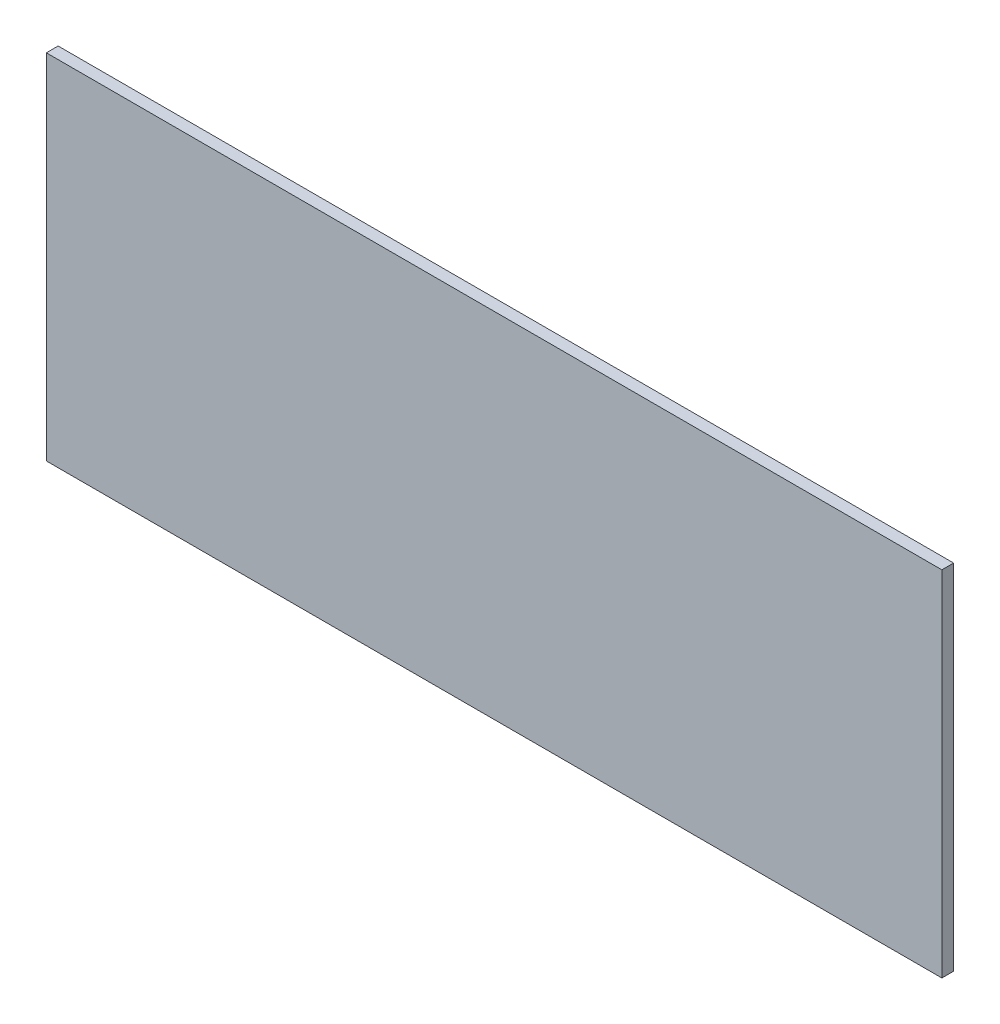
ISO-10303-21;
HEADER;
FILE_DESCRIPTION(('STEP AP214'),'2;1');
FILE_NAME('part.step','',(''),(''),'','','');
FILE_SCHEMA(('AUTOMOTIVE_DESIGN { 1 0 10303 214 1 1 1 1 }'));
ENDSEC;
DATA;
#1=APPLICATION_CONTEXT('core data for automotive mechanical design processes');
#2=APPLICATION_PROTOCOL_DEFINITION('international standard','automotive_design',2000,#1);
#3=PRODUCT_CONTEXT('',#1,'mechanical');
#4=PRODUCT('Part','Part','',(#3));
#5=PRODUCT_RELATED_PRODUCT_CATEGORY('part','',(#4));
#6=PRODUCT_DEFINITION_FORMATION('','',#4);
#7=PRODUCT_DEFINITION_CONTEXT('part definition',#1,'design');
#8=PRODUCT_DEFINITION('design','',#6,#7);
#9=PRODUCT_DEFINITION_SHAPE('','',#8);
#10=(LENGTH_UNIT() NAMED_UNIT(*) SI_UNIT(.MILLI.,.METRE.));
#11=(NAMED_UNIT(*) PLANE_ANGLE_UNIT() SI_UNIT($,.RADIAN.));
#12=(NAMED_UNIT(*) SI_UNIT($,.STERADIAN.) SOLID_ANGLE_UNIT());
#13=UNCERTAINTY_MEASURE_WITH_UNIT(LENGTH_MEASURE(1.E-05),#10,'distance_accuracy_value','');
#14=(GEOMETRIC_REPRESENTATION_CONTEXT(3) GLOBAL_UNCERTAINTY_ASSIGNED_CONTEXT((#13)) GLOBAL_UNIT_ASSIGNED_CONTEXT((#10,
#11,#12)) REPRESENTATION_CONTEXT('',''));
#15=CARTESIAN_POINT('',(0.,0.,0.));
#16=DIRECTION('',(0.,0.,1.));
#17=DIRECTION('',(1.,0.,0.));
#18=AXIS2_PLACEMENT_3D('',#15,#16,#17);
#19=CARTESIAN_POINT('',(-191.531306325637,22.8926701570681,5.));
#20=DIRECTION('',(1.,0.,0.));
#21=DIRECTION('',(0.,1.,0.));
#22=AXIS2_PLACEMENT_3D('',#19,#20,#21);
#23=PLANE('',#22);
#24=DIRECTION('',(0.,-1.,0.));
#25=VECTOR('',#24,1.);
#26=CARTESIAN_POINT('',(-191.531306325637,22.8926701570681,0.));
#27=LINE('',#26,#25);
#28=CARTESIAN_POINT('',(-191.531306325637,22.8926701570681,0.));
#29=VERTEX_POINT('',#28);
#30=CARTESIAN_POINT('',(-191.531306325637,-127.107329842932,0.));
#31=VERTEX_POINT('',#30);
#32=EDGE_CURVE('E96',#29,#31,#27,.T.);
#33=ORIENTED_EDGE('',*,*,#32,.T.);
#34=DIRECTION('',(0.,0.,-1.));
#35=VECTOR('',#34,1.);
#36=CARTESIAN_POINT('',(-191.531306325637,-127.107329842932,5.));
#37=LINE('',#36,#35);
#38=CARTESIAN_POINT('',(-191.531306325637,-127.107329842932,5.));
#39=VERTEX_POINT('',#38);
#40=EDGE_CURVE('E11',#39,#31,#37,.T.);
#41=ORIENTED_EDGE('',*,*,#40,.F.);
#42=DIRECTION('',(0.,-1.,0.));
#43=VECTOR('',#42,1.);
#44=CARTESIAN_POINT('',(-191.531306325637,22.8926701570681,5.));
#45=LINE('',#44,#43);
#46=CARTESIAN_POINT('',(-191.531306325637,22.8926701570681,5.));
#47=VERTEX_POINT('',#46);
#48=EDGE_CURVE('E84',#47,#39,#45,.T.);
#49=ORIENTED_EDGE('',*,*,#48,.F.);
#50=DIRECTION('',(0.,0.,-1.));
#51=VECTOR('',#50,1.);
#52=CARTESIAN_POINT('',(-191.531306325637,22.8926701570681,5.));
#53=LINE('',#52,#51);
#54=EDGE_CURVE('E92',#47,#29,#53,.T.);
#55=ORIENTED_EDGE('',*,*,#54,.T.);
#56=EDGE_LOOP('',(#33,#41,#49,#55));
#57=FACE_BOUND('',#56,.T.);
#58=ADVANCED_FACE('F33',(#57),#23,.F.);
#59=CARTESIAN_POINT('',(-191.531306325637,-127.107329842932,5.));
#60=DIRECTION('',(0.,1.,0.));
#61=DIRECTION('',(0.,0.,1.));
#62=AXIS2_PLACEMENT_3D('',#59,#60,#61);
#63=PLANE('',#62);
#64=DIRECTION('',(1.,0.,0.));
#65=VECTOR('',#64,1.);
#66=CARTESIAN_POINT('',(-191.531306325637,-127.107329842932,0.));
#67=LINE('',#66,#65);
#68=CARTESIAN_POINT('',(188.468693674363,-127.107329842932,0.));
#69=VERTEX_POINT('',#68);
#70=EDGE_CURVE('E88',#31,#69,#67,.T.);
#71=ORIENTED_EDGE('',*,*,#70,.T.);
#72=DIRECTION('',(0.,0.,-1.));
#73=VECTOR('',#72,1.);
#74=CARTESIAN_POINT('',(188.468693674363,-127.107329842932,5.));
#75=LINE('',#74,#73);
#76=CARTESIAN_POINT('',(188.468693674363,-127.107329842932,5.));
#77=VERTEX_POINT('',#76);
#78=EDGE_CURVE('E41',#77,#69,#75,.T.);
#79=ORIENTED_EDGE('',*,*,#78,.F.);
#80=DIRECTION('',(1.,0.,0.));
#81=VECTOR('',#80,1.);
#82=CARTESIAN_POINT('',(-191.531306325637,-127.107329842932,5.));
#83=LINE('',#82,#81);
#84=EDGE_CURVE('E79',#39,#77,#83,.T.);
#85=ORIENTED_EDGE('',*,*,#84,.F.);
#86=ORIENTED_EDGE('',*,*,#40,.T.);
#87=EDGE_LOOP('',(#71,#79,#85,#86));
#88=FACE_BOUND('',#87,.T.);
#89=ADVANCED_FACE('F87',(#88),#63,.F.);
#90=CARTESIAN_POINT('',(188.468693674363,22.8926701570681,5.));
#91=DIRECTION('',(-1.,0.,0.));
#92=DIRECTION('',(0.,-1.,0.));
#93=AXIS2_PLACEMENT_3D('',#90,#91,#92);
#94=PLANE('',#93);
#95=DIRECTION('',(0.,1.,0.));
#96=VECTOR('',#95,1.);
#97=CARTESIAN_POINT('',(188.468693674363,22.8926701570681,0.));
#98=LINE('',#97,#96);
#99=CARTESIAN_POINT('',(188.468693674363,22.8926701570681,0.));
#100=VERTEX_POINT('',#99);
#101=EDGE_CURVE('E66',#69,#100,#98,.T.);
#102=ORIENTED_EDGE('',*,*,#101,.T.);
#103=DIRECTION('',(0.,0.,-1.));
#104=VECTOR('',#103,1.);
#105=CARTESIAN_POINT('',(188.468693674363,22.8926701570681,5.));
#106=LINE('',#105,#104);
#107=CARTESIAN_POINT('',(188.468693674363,22.8926701570681,5.));
#108=VERTEX_POINT('',#107);
#109=EDGE_CURVE('E89',#108,#100,#106,.T.);
#110=ORIENTED_EDGE('',*,*,#109,.F.);
#111=DIRECTION('',(0.,1.,0.));
#112=VECTOR('',#111,1.);
#113=CARTESIAN_POINT('',(188.468693674363,22.8926701570681,5.));
#114=LINE('',#113,#112);
#115=EDGE_CURVE('E82',#77,#108,#114,.T.);
#116=ORIENTED_EDGE('',*,*,#115,.F.);
#117=ORIENTED_EDGE('',*,*,#78,.T.);
#118=EDGE_LOOP('',(#102,#110,#116,#117));
#119=FACE_BOUND('',#118,.T.);
#120=ADVANCED_FACE('F90',(#119),#94,.F.);
#121=CARTESIAN_POINT('',(-191.531306325637,22.8926701570681,5.));
#122=DIRECTION('',(0.,-1.,0.));
#123=DIRECTION('',(0.,0.,-1.));
#124=AXIS2_PLACEMENT_3D('',#121,#122,#123);
#125=PLANE('',#124);
#126=DIRECTION('',(-1.,0.,0.));
#127=VECTOR('',#126,1.);
#128=CARTESIAN_POINT('',(-191.531306325637,22.8926701570681,0.));
#129=LINE('',#128,#127);
#130=EDGE_CURVE('E72',#100,#29,#129,.T.);
#131=ORIENTED_EDGE('',*,*,#130,.T.);
#132=ORIENTED_EDGE('',*,*,#54,.F.);
#133=DIRECTION('',(-1.,0.,0.));
#134=VECTOR('',#133,1.);
#135=CARTESIAN_POINT('',(-191.531306325637,22.8926701570681,5.));
#136=LINE('',#135,#134);
#137=EDGE_CURVE('E49',#108,#47,#136,.T.);
#138=ORIENTED_EDGE('',*,*,#137,.F.);
#139=ORIENTED_EDGE('',*,*,#109,.T.);
#140=EDGE_LOOP('',(#131,#132,#138,#139));
#141=FACE_BOUND('',#140,.T.);
#142=ADVANCED_FACE('F103',(#141),#125,.F.);
#143=CARTESIAN_POINT('',(0.,0.,5.));
#144=DIRECTION('',(0.,0.,1.));
#145=DIRECTION('',(1.,0.,0.));
#146=AXIS2_PLACEMENT_3D('',#143,#144,#145);
#147=PLANE('',#146);
#148=ORIENTED_EDGE('',*,*,#48,.T.);
#149=ORIENTED_EDGE('',*,*,#84,.T.);
#150=ORIENTED_EDGE('',*,*,#115,.T.);
#151=ORIENTED_EDGE('',*,*,#137,.T.);
#152=EDGE_LOOP('',(#148,#149,#150,#151));
#153=FACE_BOUND('',#152,.T.);
#154=ADVANCED_FACE('F80',(#153),#147,.T.);
#155=CARTESIAN_POINT('',(0.,0.,0.));
#156=DIRECTION('',(0.,0.,1.));
#157=DIRECTION('',(1.,0.,0.));
#158=AXIS2_PLACEMENT_3D('',#155,#156,#157);
#159=PLANE('',#158);
#160=ORIENTED_EDGE('',*,*,#32,.F.);
#161=ORIENTED_EDGE('',*,*,#130,.F.);
#162=ORIENTED_EDGE('',*,*,#101,.F.);
#163=ORIENTED_EDGE('',*,*,#70,.F.);
#164=EDGE_LOOP('',(#160,#161,#162,#163));
#165=FACE_BOUND('',#164,.T.);
#166=ADVANCED_FACE('F106',(#165),#159,.F.);
#167=CLOSED_SHELL('',(#58,#89,#120,#142,#154,#166));
#168=MANIFOLD_SOLID_BREP('B2',#167);
#169=ADVANCED_BREP_SHAPE_REPRESENTATION('',(#18,#168),#14);
#170=SHAPE_DEFINITION_REPRESENTATION(#9,#169);
ENDSEC;
END-ISO-10303-21;
